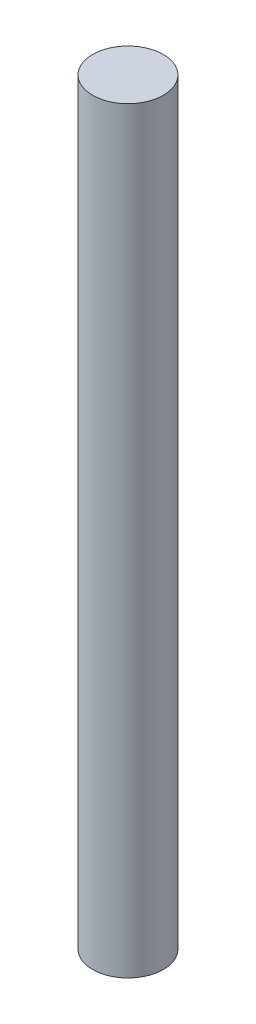
ISO-10303-21;
HEADER;
FILE_DESCRIPTION(('STEP AP214'),'2;1');
FILE_NAME('part.step','',(''),(''),'','','');
FILE_SCHEMA(('AUTOMOTIVE_DESIGN { 1 0 10303 214 1 1 1 1 }'));
ENDSEC;
DATA;
#1=APPLICATION_CONTEXT('core data for automotive mechanical design processes');
#2=APPLICATION_PROTOCOL_DEFINITION('international standard','automotive_design',2000,#1);
#3=PRODUCT_CONTEXT('',#1,'mechanical');
#4=PRODUCT('Part','Part','',(#3));
#5=PRODUCT_RELATED_PRODUCT_CATEGORY('part','',(#4));
#6=PRODUCT_DEFINITION_FORMATION('','',#4);
#7=PRODUCT_DEFINITION_CONTEXT('part definition',#1,'design');
#8=PRODUCT_DEFINITION('design','',#6,#7);
#9=PRODUCT_DEFINITION_SHAPE('','',#8);
#10=(LENGTH_UNIT() NAMED_UNIT(*) SI_UNIT(.MILLI.,.METRE.));
#11=(NAMED_UNIT(*) PLANE_ANGLE_UNIT() SI_UNIT($,.RADIAN.));
#12=(NAMED_UNIT(*) SI_UNIT($,.STERADIAN.) SOLID_ANGLE_UNIT());
#13=UNCERTAINTY_MEASURE_WITH_UNIT(LENGTH_MEASURE(1.E-05),#10,'distance_accuracy_value','');
#14=(GEOMETRIC_REPRESENTATION_CONTEXT(3) GLOBAL_UNCERTAINTY_ASSIGNED_CONTEXT((#13)) GLOBAL_UNIT_ASSIGNED_CONTEXT((#10,
#11,#12)) REPRESENTATION_CONTEXT('',''));
#15=CARTESIAN_POINT('',(0.,0.,0.));
#16=DIRECTION('',(0.,0.,1.));
#17=DIRECTION('',(1.,0.,0.));
#18=AXIS2_PLACEMENT_3D('',#15,#16,#17);
#19=CARTESIAN_POINT('',(0.,34.,0.));
#20=DIRECTION('',(0.,-1.,0.));
#21=DIRECTION('',(0.,0.,-1.));
#22=AXIS2_PLACEMENT_3D('',#19,#20,#21);
#23=CYLINDRICAL_SURFACE('',#22,1.5875);
#24=CARTESIAN_POINT('',(0.,34.,0.));
#25=DIRECTION('',(0.,1.,0.));
#26=DIRECTION('',(0.,0.,1.));
#27=AXIS2_PLACEMENT_3D('',#24,#25,#26);
#28=CIRCLE('',#27,1.5875);
#29=CARTESIAN_POINT('',(0.,34.,1.5875));
#30=VERTEX_POINT('',#29);
#31=EDGE_CURVE('E10',#30,#30,#28,.T.);
#32=ORIENTED_EDGE('',*,*,#31,.F.);
#33=EDGE_LOOP('',(#32));
#34=FACE_BOUND('',#33,.T.);
#35=CARTESIAN_POINT('',(0.,0.,0.));
#36=DIRECTION('',(0.,1.,0.));
#37=DIRECTION('',(0.,0.,1.));
#38=AXIS2_PLACEMENT_3D('',#35,#36,#37);
#39=CIRCLE('',#38,1.5875);
#40=CARTESIAN_POINT('',(0.,0.,1.5875));
#41=VERTEX_POINT('',#40);
#42=EDGE_CURVE('E34',#41,#41,#39,.T.);
#43=ORIENTED_EDGE('',*,*,#42,.T.);
#44=EDGE_LOOP('',(#43));
#45=FACE_BOUND('',#44,.T.);
#46=ADVANCED_FACE('F31',(#34,#45),#23,.T.);
#47=CARTESIAN_POINT('',(0.,34.,0.));
#48=DIRECTION('',(0.,1.,0.));
#49=DIRECTION('',(0.,0.,1.));
#50=AXIS2_PLACEMENT_3D('',#47,#48,#49);
#51=PLANE('',#50);
#52=ORIENTED_EDGE('',*,*,#31,.T.);
#53=EDGE_LOOP('',(#52));
#54=FACE_BOUND('',#53,.T.);
#55=ADVANCED_FACE('F46',(#54),#51,.T.);
#56=CARTESIAN_POINT('',(0.,0.,0.));
#57=DIRECTION('',(0.,1.,0.));
#58=DIRECTION('',(0.,0.,1.));
#59=AXIS2_PLACEMENT_3D('',#56,#57,#58);
#60=PLANE('',#59);
#61=ORIENTED_EDGE('',*,*,#42,.F.);
#62=EDGE_LOOP('',(#61));
#63=FACE_BOUND('',#62,.T.);
#64=ADVANCED_FACE('F44',(#63),#60,.F.);
#65=CLOSED_SHELL('',(#46,#55,#64));
#66=MANIFOLD_SOLID_BREP('B2',#65);
#67=ADVANCED_BREP_SHAPE_REPRESENTATION('',(#18,#66),#14);
#68=SHAPE_DEFINITION_REPRESENTATION(#9,#67);
ENDSEC;
END-ISO-10303-21;
